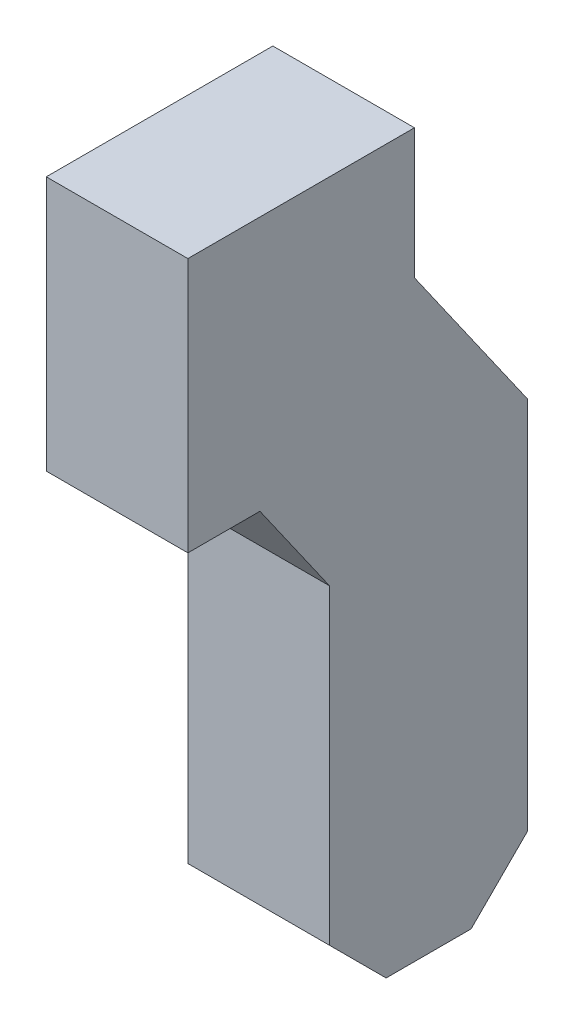
ISO-10303-21;
HEADER;
FILE_DESCRIPTION(('STEP AP214'),'2;1');
FILE_NAME('part.step','',(''),(''),'','','');
FILE_SCHEMA(('AUTOMOTIVE_DESIGN { 1 0 10303 214 1 1 1 1 }'));
ENDSEC;
DATA;
#1=APPLICATION_CONTEXT('core data for automotive mechanical design processes');
#2=APPLICATION_PROTOCOL_DEFINITION('international standard','automotive_design',2000,#1);
#3=PRODUCT_CONTEXT('',#1,'mechanical');
#4=PRODUCT('Part','Part','',(#3));
#5=PRODUCT_RELATED_PRODUCT_CATEGORY('part','',(#4));
#6=PRODUCT_DEFINITION_FORMATION('','',#4);
#7=PRODUCT_DEFINITION_CONTEXT('part definition',#1,'design');
#8=PRODUCT_DEFINITION('design','',#6,#7);
#9=PRODUCT_DEFINITION_SHAPE('','',#8);
#10=(LENGTH_UNIT() NAMED_UNIT(*) SI_UNIT(.MILLI.,.METRE.));
#11=(NAMED_UNIT(*) PLANE_ANGLE_UNIT() SI_UNIT($,.RADIAN.));
#12=(NAMED_UNIT(*) SI_UNIT($,.STERADIAN.) SOLID_ANGLE_UNIT());
#13=UNCERTAINTY_MEASURE_WITH_UNIT(LENGTH_MEASURE(1.E-05),#10,'distance_accuracy_value','');
#14=(GEOMETRIC_REPRESENTATION_CONTEXT(3) GLOBAL_UNCERTAINTY_ASSIGNED_CONTEXT((#13)) GLOBAL_UNIT_ASSIGNED_CONTEXT((#10,
#11,#12)) REPRESENTATION_CONTEXT('',''));
#15=CARTESIAN_POINT('',(0.,0.,0.));
#16=DIRECTION('',(0.,0.,1.));
#17=DIRECTION('',(1.,0.,0.));
#18=AXIS2_PLACEMENT_3D('',#15,#16,#17);
#19=CARTESIAN_POINT('',(-1.375,0.,-2.4));
#20=DIRECTION('',(-1.,0.,0.));
#21=DIRECTION('',(0.,0.,1.));
#22=AXIS2_PLACEMENT_3D('',#19,#20,#21);
#23=PLANE('',#22);
#24=DIRECTION('',(0.,0.819152044282436,0.573576436360408));
#25=VECTOR('',#24,1.);
#26=CARTESIAN_POINT('',(-1.37500000001,-2.550354576118,-2.10000000001));
#27=LINE('',#26,#25);
#28=CARTESIAN_POINT('',(-1.375,-2.550354576108,-2.1));
#29=VERTEX_POINT('',#28);
#30=CARTESIAN_POINT('',(-1.375,-2.375,-1.97721540395));
#31=VERTEX_POINT('',#30);
#32=EDGE_CURVE('E11',#29,#31,#27,.T.);
#33=ORIENTED_EDGE('',*,*,#32,.F.);
#34=DIRECTION('',(0.,1.,0.));
#35=VECTOR('',#34,1.);
#36=CARTESIAN_POINT('',(-1.37500000001,-3.10000000001,-2.10000000001));
#37=LINE('',#36,#35);
#38=CARTESIAN_POINT('',(-1.375,-3.1,-2.1));
#39=VERTEX_POINT('',#38);
#40=EDGE_CURVE('E24',#39,#29,#37,.T.);
#41=ORIENTED_EDGE('',*,*,#40,.F.);
#42=DIRECTION('',(0.,0.707106781186548,0.707106781186548));
#43=VECTOR('',#42,1.);
#44=CARTESIAN_POINT('',(-1.37500000001,-3.20000000001,-2.20000000001));
#45=LINE('',#44,#43);
#46=CARTESIAN_POINT('',(-1.375,-3.2,-2.2));
#47=VERTEX_POINT('',#46);
#48=EDGE_CURVE('E192',#47,#39,#45,.T.);
#49=ORIENTED_EDGE('',*,*,#48,.F.);
#50=DIRECTION('',(0.,0.,1.));
#51=VECTOR('',#50,1.);
#52=CARTESIAN_POINT('',(-1.37500000001,-3.20000000001,-2.35000000001));
#53=LINE('',#52,#51);
#54=CARTESIAN_POINT('',(-1.375,-3.2,-2.35));
#55=VERTEX_POINT('',#54);
#56=EDGE_CURVE('E189',#55,#47,#53,.T.);
#57=ORIENTED_EDGE('',*,*,#56,.F.);
#58=DIRECTION('',(0.,-0.707106781186548,0.707106781186548));
#59=VECTOR('',#58,1.);
#60=CARTESIAN_POINT('',(-1.37500000001,-3.10000000001,-2.45000000001));
#61=LINE('',#60,#59);
#62=CARTESIAN_POINT('',(-1.375,-3.1,-2.45));
#63=VERTEX_POINT('',#62);
#64=EDGE_CURVE('E186',#63,#55,#61,.T.);
#65=ORIENTED_EDGE('',*,*,#64,.F.);
#66=DIRECTION('',(0.,-1.,0.));
#67=VECTOR('',#66,1.);
#68=CARTESIAN_POINT('',(-1.37500000001,-2.44000000001,-2.45000000001));
#69=LINE('',#68,#67);
#70=CARTESIAN_POINT('',(-1.375,-2.44,-2.45));
#71=VERTEX_POINT('',#70);
#72=EDGE_CURVE('E183',#71,#63,#69,.T.);
#73=ORIENTED_EDGE('',*,*,#72,.F.);
#74=DIRECTION('',(0.,-0.819152044284977,-0.57357643635678));
#75=VECTOR('',#74,1.);
#76=CARTESIAN_POINT('',(-1.37500000001,-2.154370398662,-2.25000000001));
#77=LINE('',#76,#75);
#78=CARTESIAN_POINT('',(-1.375,-2.154370398652,-2.25));
#79=VERTEX_POINT('',#78);
#80=EDGE_CURVE('E180',#79,#71,#77,.T.);
#81=ORIENTED_EDGE('',*,*,#80,.F.);
#82=DIRECTION('',(0.,-1.,0.));
#83=VECTOR('',#82,1.);
#84=CARTESIAN_POINT('',(-1.37500000001,-1.92500000001,-2.25000000001));
#85=LINE('',#84,#83);
#86=CARTESIAN_POINT('',(-1.375,-1.925,-2.25));
#87=VERTEX_POINT('',#86);
#88=EDGE_CURVE('E177',#87,#79,#85,.T.);
#89=ORIENTED_EDGE('',*,*,#88,.F.);
#90=DIRECTION('',(0.,0.,-1.));
#91=VECTOR('',#90,1.);
#92=CARTESIAN_POINT('',(-1.37500000001,-1.92500000001,-1.85000000001));
#93=LINE('',#92,#91);
#94=CARTESIAN_POINT('',(-1.375,-1.925,-1.85));
#95=VERTEX_POINT('',#94);
#96=EDGE_CURVE('E175',#95,#87,#93,.T.);
#97=ORIENTED_EDGE('',*,*,#96,.F.);
#98=DIRECTION('',(0.,1.,0.));
#99=VECTOR('',#98,1.);
#100=CARTESIAN_POINT('',(-1.37500000001,-2.37500000001,-1.85000000001));
#101=LINE('',#100,#99);
#102=CARTESIAN_POINT('',(-1.375,-2.375,-1.85));
#103=VERTEX_POINT('',#102);
#104=EDGE_CURVE('E120',#103,#95,#101,.T.);
#105=ORIENTED_EDGE('',*,*,#104,.F.);
#106=DIRECTION('',(0.,0.,1.));
#107=VECTOR('',#106,1.);
#108=CARTESIAN_POINT('',(-1.37500000001,-2.37500000001,-1.97721540396));
#109=LINE('',#108,#107);
#110=EDGE_CURVE('E171',#31,#103,#109,.T.);
#111=ORIENTED_EDGE('',*,*,#110,.F.);
#112=EDGE_LOOP('',(#33,#41,#49,#57,#65,#73,#81,#89,#97,#105,#111));
#113=FACE_BOUND('',#112,.T.);
#114=ADVANCED_FACE('F17',(#113),#23,.F.);
#115=CARTESIAN_POINT('',(-1.625,-2.375,-1.97721540395));
#116=DIRECTION('',(0.,-1.,0.));
#117=DIRECTION('',(0.,0.,-1.));
#118=AXIS2_PLACEMENT_3D('',#115,#116,#117);
#119=PLANE('',#118);
#120=DIRECTION('',(1.,0.,0.));
#121=VECTOR('',#120,1.);
#122=CARTESIAN_POINT('',(-1.62500000001,-2.37500000001,-1.97721540396));
#123=LINE('',#122,#121);
#124=CARTESIAN_POINT('',(-1.625,-2.375,-1.97721540395));
#125=VERTEX_POINT('',#124);
#126=EDGE_CURVE('E168',#125,#31,#123,.T.);
#127=ORIENTED_EDGE('',*,*,#126,.T.);
#128=ORIENTED_EDGE('',*,*,#110,.T.);
#129=DIRECTION('',(-1.,0.,0.));
#130=VECTOR('',#129,1.);
#131=CARTESIAN_POINT('',(-1.37500000001,-2.37500000001,-1.85000000001));
#132=LINE('',#131,#130);
#133=CARTESIAN_POINT('',(-1.625,-2.375,-1.85));
#134=VERTEX_POINT('',#133);
#135=EDGE_CURVE('E166',#103,#134,#132,.T.);
#136=ORIENTED_EDGE('',*,*,#135,.T.);
#137=DIRECTION('',(0.,0.,1.));
#138=VECTOR('',#137,1.);
#139=CARTESIAN_POINT('',(-1.62500000001,-2.37500000001,-1.97721540396));
#140=LINE('',#139,#138);
#141=EDGE_CURVE('E103',#125,#134,#140,.T.);
#142=ORIENTED_EDGE('',*,*,#141,.F.);
#143=EDGE_LOOP('',(#127,#128,#136,#142));
#144=FACE_BOUND('',#143,.T.);
#145=ADVANCED_FACE('F226',(#144),#119,.T.);
#146=CARTESIAN_POINT('',(-1.625,-3.2,-2.35));
#147=DIRECTION('',(0.,-1.,0.));
#148=DIRECTION('',(0.,0.,-1.));
#149=AXIS2_PLACEMENT_3D('',#146,#147,#148);
#150=PLANE('',#149);
#151=DIRECTION('',(1.,0.,0.));
#152=VECTOR('',#151,1.);
#153=CARTESIAN_POINT('',(-1.62500000001,-3.20000000001,-2.35000000001));
#154=LINE('',#153,#152);
#155=CARTESIAN_POINT('',(-1.625,-3.2,-2.35));
#156=VERTEX_POINT('',#155);
#157=EDGE_CURVE('E162',#156,#55,#154,.T.);
#158=ORIENTED_EDGE('',*,*,#157,.T.);
#159=ORIENTED_EDGE('',*,*,#56,.T.);
#160=DIRECTION('',(1.,0.,0.));
#161=VECTOR('',#160,1.);
#162=CARTESIAN_POINT('',(-1.62500000001,-3.20000000001,-2.20000000001));
#163=LINE('',#162,#161);
#164=CARTESIAN_POINT('',(-1.625,-3.2,-2.2));
#165=VERTEX_POINT('',#164);
#166=EDGE_CURVE('E159',#165,#47,#163,.T.);
#167=ORIENTED_EDGE('',*,*,#166,.F.);
#168=DIRECTION('',(0.,0.,1.));
#169=VECTOR('',#168,1.);
#170=CARTESIAN_POINT('',(-1.62500000001,-3.20000000001,-2.35000000001));
#171=LINE('',#170,#169);
#172=EDGE_CURVE('E156',#156,#165,#171,.T.);
#173=ORIENTED_EDGE('',*,*,#172,.F.);
#174=EDGE_LOOP('',(#158,#159,#167,#173));
#175=FACE_BOUND('',#174,.T.);
#176=ADVANCED_FACE('F204',(#175),#150,.T.);
#177=CARTESIAN_POINT('',(-1.625,-2.550354576108,-2.1));
#178=DIRECTION('',(0.,-0.573576436351011,0.819152044289016));
#179=DIRECTION('',(-1.,0.,0.));
#180=AXIS2_PLACEMENT_3D('',#177,#178,#179);
#181=PLANE('',#180);
#182=DIRECTION('',(1.,0.,0.));
#183=VECTOR('',#182,1.);
#184=CARTESIAN_POINT('',(-1.62500000001,-2.550354576118,-2.10000000001));
#185=LINE('',#184,#183);
#186=CARTESIAN_POINT('',(-1.625,-2.550354576108,-2.1));
#187=VERTEX_POINT('',#186);
#188=EDGE_CURVE('E154',#187,#29,#185,.T.);
#189=ORIENTED_EDGE('',*,*,#188,.T.);
#190=ORIENTED_EDGE('',*,*,#32,.T.);
#191=ORIENTED_EDGE('',*,*,#126,.F.);
#192=DIRECTION('',(0.,0.819152044282436,0.573576436360408));
#193=VECTOR('',#192,1.);
#194=CARTESIAN_POINT('',(-1.62500000001,-2.550354576118,-2.10000000001));
#195=LINE('',#194,#193);
#196=EDGE_CURVE('E152',#187,#125,#195,.T.);
#197=ORIENTED_EDGE('',*,*,#196,.F.);
#198=EDGE_LOOP('',(#189,#190,#191,#197));
#199=FACE_BOUND('',#198,.T.);
#200=ADVANCED_FACE('F198',(#199),#181,.T.);
#201=CARTESIAN_POINT('',(-1.625,-3.1,-2.45));
#202=DIRECTION('',(0.,-0.707106781186548,-0.707106781186548));
#203=DIRECTION('',(0.,-0.707106781186548,0.707106781186548));
#204=AXIS2_PLACEMENT_3D('',#201,#202,#203);
#205=PLANE('',#204);
#206=DIRECTION('',(1.,0.,0.));
#207=VECTOR('',#206,1.);
#208=CARTESIAN_POINT('',(-1.62500000001,-3.10000000001,-2.45000000001));
#209=LINE('',#208,#207);
#210=CARTESIAN_POINT('',(-1.625,-3.1,-2.45));
#211=VERTEX_POINT('',#210);
#212=EDGE_CURVE('E149',#211,#63,#209,.T.);
#213=ORIENTED_EDGE('',*,*,#212,.T.);
#214=ORIENTED_EDGE('',*,*,#64,.T.);
#215=ORIENTED_EDGE('',*,*,#157,.F.);
#216=DIRECTION('',(0.,-0.707106781186548,0.707106781186548));
#217=VECTOR('',#216,1.);
#218=CARTESIAN_POINT('',(-1.62500000001,-3.10000000001,-2.45000000001));
#219=LINE('',#218,#217);
#220=EDGE_CURVE('E146',#211,#156,#219,.T.);
#221=ORIENTED_EDGE('',*,*,#220,.F.);
#222=EDGE_LOOP('',(#213,#214,#215,#221));
#223=FACE_BOUND('',#222,.T.);
#224=ADVANCED_FACE('F207',(#223),#205,.T.);
#225=CARTESIAN_POINT('',(-1.625,-3.1,-2.1));
#226=DIRECTION('',(0.,0.,1.));
#227=DIRECTION('',(1.,0.,0.));
#228=AXIS2_PLACEMENT_3D('',#225,#226,#227);
#229=PLANE('',#228);
#230=DIRECTION('',(1.,0.,0.));
#231=VECTOR('',#230,1.);
#232=CARTESIAN_POINT('',(-1.62500000001,-3.10000000001,-2.10000000001));
#233=LINE('',#232,#231);
#234=CARTESIAN_POINT('',(-1.625,-3.1,-2.1));
#235=VERTEX_POINT('',#234);
#236=EDGE_CURVE('E143',#235,#39,#233,.T.);
#237=ORIENTED_EDGE('',*,*,#236,.T.);
#238=ORIENTED_EDGE('',*,*,#40,.T.);
#239=ORIENTED_EDGE('',*,*,#188,.F.);
#240=DIRECTION('',(0.,1.,0.));
#241=VECTOR('',#240,1.);
#242=CARTESIAN_POINT('',(-1.62500000001,-3.10000000001,-2.10000000001));
#243=LINE('',#242,#241);
#244=EDGE_CURVE('E140',#235,#187,#243,.T.);
#245=ORIENTED_EDGE('',*,*,#244,.F.);
#246=EDGE_LOOP('',(#237,#238,#239,#245));
#247=FACE_BOUND('',#246,.T.);
#248=ADVANCED_FACE('F195',(#247),#229,.T.);
#249=CARTESIAN_POINT('',(-1.625,-2.44,-2.45));
#250=DIRECTION('',(0.,0.,-1.));
#251=DIRECTION('',(0.,-1.,0.));
#252=AXIS2_PLACEMENT_3D('',#249,#250,#251);
#253=PLANE('',#252);
#254=DIRECTION('',(1.,0.,0.));
#255=VECTOR('',#254,1.);
#256=CARTESIAN_POINT('',(-1.62500000001,-2.44000000001,-2.45000000001));
#257=LINE('',#256,#255);
#258=CARTESIAN_POINT('',(-1.625,-2.44,-2.45));
#259=VERTEX_POINT('',#258);
#260=EDGE_CURVE('E137',#259,#71,#257,.T.);
#261=ORIENTED_EDGE('',*,*,#260,.T.);
#262=ORIENTED_EDGE('',*,*,#72,.T.);
#263=ORIENTED_EDGE('',*,*,#212,.F.);
#264=DIRECTION('',(0.,-1.,0.));
#265=VECTOR('',#264,1.);
#266=CARTESIAN_POINT('',(-1.62500000001,-2.44000000001,-2.45000000001));
#267=LINE('',#266,#265);
#268=EDGE_CURVE('E134',#259,#211,#267,.T.);
#269=ORIENTED_EDGE('',*,*,#268,.F.);
#270=EDGE_LOOP('',(#261,#262,#263,#269));
#271=FACE_BOUND('',#270,.T.);
#272=ADVANCED_FACE('F209',(#271),#253,.T.);
#273=CARTESIAN_POINT('',(-1.625,-3.2,-2.2));
#274=DIRECTION('',(0.,-0.707106781186548,0.707106781186548));
#275=DIRECTION('',(-1.,0.,0.));
#276=AXIS2_PLACEMENT_3D('',#273,#274,#275);
#277=PLANE('',#276);
#278=ORIENTED_EDGE('',*,*,#166,.T.);
#279=ORIENTED_EDGE('',*,*,#48,.T.);
#280=ORIENTED_EDGE('',*,*,#236,.F.);
#281=DIRECTION('',(0.,0.707106781186548,0.707106781186548));
#282=VECTOR('',#281,1.);
#283=CARTESIAN_POINT('',(-1.62500000001,-3.20000000001,-2.20000000001));
#284=LINE('',#283,#282);
#285=EDGE_CURVE('E131',#165,#235,#284,.T.);
#286=ORIENTED_EDGE('',*,*,#285,.F.);
#287=EDGE_LOOP('',(#278,#279,#280,#286));
#288=FACE_BOUND('',#287,.T.);
#289=ADVANCED_FACE('F202',(#288),#277,.T.);
#290=CARTESIAN_POINT('',(-1.625,-0.685,-2.25));
#291=DIRECTION('',(0.,0.,-1.));
#292=DIRECTION('',(0.,-1.,0.));
#293=AXIS2_PLACEMENT_3D('',#290,#291,#292);
#294=PLANE('',#293);
#295=DIRECTION('',(-1.,0.,0.));
#296=VECTOR('',#295,1.);
#297=CARTESIAN_POINT('',(-1.37500000001,-1.92500000001,-2.25000000001));
#298=LINE('',#297,#296);
#299=CARTESIAN_POINT('',(-1.625,-1.925,-2.25));
#300=VERTEX_POINT('',#299);
#301=EDGE_CURVE('E115',#87,#300,#298,.T.);
#302=ORIENTED_EDGE('',*,*,#301,.F.);
#303=ORIENTED_EDGE('',*,*,#88,.T.);
#304=DIRECTION('',(1.,0.,0.));
#305=VECTOR('',#304,1.);
#306=CARTESIAN_POINT('',(-1.62500000001,-2.154370398662,-2.25000000001));
#307=LINE('',#306,#305);
#308=CARTESIAN_POINT('',(-1.625,-2.154370398652,-2.25));
#309=VERTEX_POINT('',#308);
#310=EDGE_CURVE('E127',#309,#79,#307,.T.);
#311=ORIENTED_EDGE('',*,*,#310,.F.);
#312=DIRECTION('',(0.,-1.,0.));
#313=VECTOR('',#312,1.);
#314=CARTESIAN_POINT('',(-1.62500000001,-1.92500000001,-2.25000000001));
#315=LINE('',#314,#313);
#316=EDGE_CURVE('E125',#300,#309,#315,.T.);
#317=ORIENTED_EDGE('',*,*,#316,.F.);
#318=EDGE_LOOP('',(#302,#303,#311,#317));
#319=FACE_BOUND('',#318,.T.);
#320=ADVANCED_FACE('F215',(#319),#294,.T.);
#321=CARTESIAN_POINT('',(-1.625,-2.154370398652,-2.25));
#322=DIRECTION('',(0.,0.573576436351011,-0.819152044289016));
#323=DIRECTION('',(-1.,0.,0.));
#324=AXIS2_PLACEMENT_3D('',#321,#322,#323);
#325=PLANE('',#324);
#326=ORIENTED_EDGE('',*,*,#310,.T.);
#327=ORIENTED_EDGE('',*,*,#80,.T.);
#328=ORIENTED_EDGE('',*,*,#260,.F.);
#329=DIRECTION('',(0.,-0.819152044284977,-0.57357643635678));
#330=VECTOR('',#329,1.);
#331=CARTESIAN_POINT('',(-1.62500000001,-2.154370398662,-2.25000000001));
#332=LINE('',#331,#330);
#333=EDGE_CURVE('E107',#309,#259,#332,.T.);
#334=ORIENTED_EDGE('',*,*,#333,.F.);
#335=EDGE_LOOP('',(#326,#327,#328,#334));
#336=FACE_BOUND('',#335,.T.);
#337=ADVANCED_FACE('F213',(#336),#325,.T.);
#338=CARTESIAN_POINT('',(-1.625,0.,-2.4));
#339=DIRECTION('',(-1.,0.,0.));
#340=DIRECTION('',(0.,0.,1.));
#341=AXIS2_PLACEMENT_3D('',#338,#339,#340);
#342=PLANE('',#341);
#343=DIRECTION('',(0.,1.,0.));
#344=VECTOR('',#343,1.);
#345=CARTESIAN_POINT('',(-1.62500000001,-2.37500000001,-1.85000000001));
#346=LINE('',#345,#344);
#347=CARTESIAN_POINT('',(-1.625,-1.925,-1.85));
#348=VERTEX_POINT('',#347);
#349=EDGE_CURVE('E96',#134,#348,#346,.T.);
#350=ORIENTED_EDGE('',*,*,#349,.T.);
#351=DIRECTION('',(0.,0.,-1.));
#352=VECTOR('',#351,1.);
#353=CARTESIAN_POINT('',(-1.62500000001,-1.92500000001,-1.85000000001));
#354=LINE('',#353,#352);
#355=EDGE_CURVE('E100',#348,#300,#354,.T.);
#356=ORIENTED_EDGE('',*,*,#355,.T.);
#357=ORIENTED_EDGE('',*,*,#316,.T.);
#358=ORIENTED_EDGE('',*,*,#333,.T.);
#359=ORIENTED_EDGE('',*,*,#268,.T.);
#360=ORIENTED_EDGE('',*,*,#220,.T.);
#361=ORIENTED_EDGE('',*,*,#172,.T.);
#362=ORIENTED_EDGE('',*,*,#285,.T.);
#363=ORIENTED_EDGE('',*,*,#244,.T.);
#364=ORIENTED_EDGE('',*,*,#196,.T.);
#365=ORIENTED_EDGE('',*,*,#141,.T.);
#366=EDGE_LOOP('',(#350,#356,#357,#358,#359,#360,#361,#362,#363,#364,#365));
#367=FACE_BOUND('',#366,.T.);
#368=ADVANCED_FACE('F98',(#367),#342,.T.);
#369=CARTESIAN_POINT('',(-0.0118421448925159,-2.965382990228,-1.85));
#370=DIRECTION('',(0.,0.,1.));
#371=DIRECTION('',(1.,0.,0.));
#372=AXIS2_PLACEMENT_3D('',#369,#370,#371);
#373=PLANE('',#372);
#374=ORIENTED_EDGE('',*,*,#349,.F.);
#375=ORIENTED_EDGE('',*,*,#135,.F.);
#376=ORIENTED_EDGE('',*,*,#104,.T.);
#377=DIRECTION('',(1.,0.,0.));
#378=VECTOR('',#377,1.);
#379=CARTESIAN_POINT('',(-5.025,-1.925,-1.85));
#380=LINE('',#379,#378);
#381=EDGE_CURVE('E113',#348,#95,#380,.T.);
#382=ORIENTED_EDGE('',*,*,#381,.F.);
#383=EDGE_LOOP('',(#374,#375,#376,#382));
#384=FACE_BOUND('',#383,.T.);
#385=ADVANCED_FACE('F119',(#384),#373,.T.);
#386=CARTESIAN_POINT('',(-5.025,-1.925,-1.85));
#387=DIRECTION('',(0.,1.,0.));
#388=DIRECTION('',(1.,0.,0.));
#389=AXIS2_PLACEMENT_3D('',#386,#387,#388);
#390=PLANE('',#389);
#391=ORIENTED_EDGE('',*,*,#355,.F.);
#392=ORIENTED_EDGE('',*,*,#381,.T.);
#393=ORIENTED_EDGE('',*,*,#96,.T.);
#394=ORIENTED_EDGE('',*,*,#301,.T.);
#395=EDGE_LOOP('',(#391,#392,#393,#394));
#396=FACE_BOUND('',#395,.T.);
#397=ADVANCED_FACE('F111',(#396),#390,.T.);
#398=CLOSED_SHELL('',(#114,#145,#176,#200,#224,#248,#272,#289,#320,#337,#368,#385,#397));
#399=MANIFOLD_SOLID_BREP('B1',#398);
#400=ADVANCED_BREP_SHAPE_REPRESENTATION('',(#18,#399),#14);
#401=SHAPE_DEFINITION_REPRESENTATION(#9,#400);
ENDSEC;
END-ISO-10303-21;
